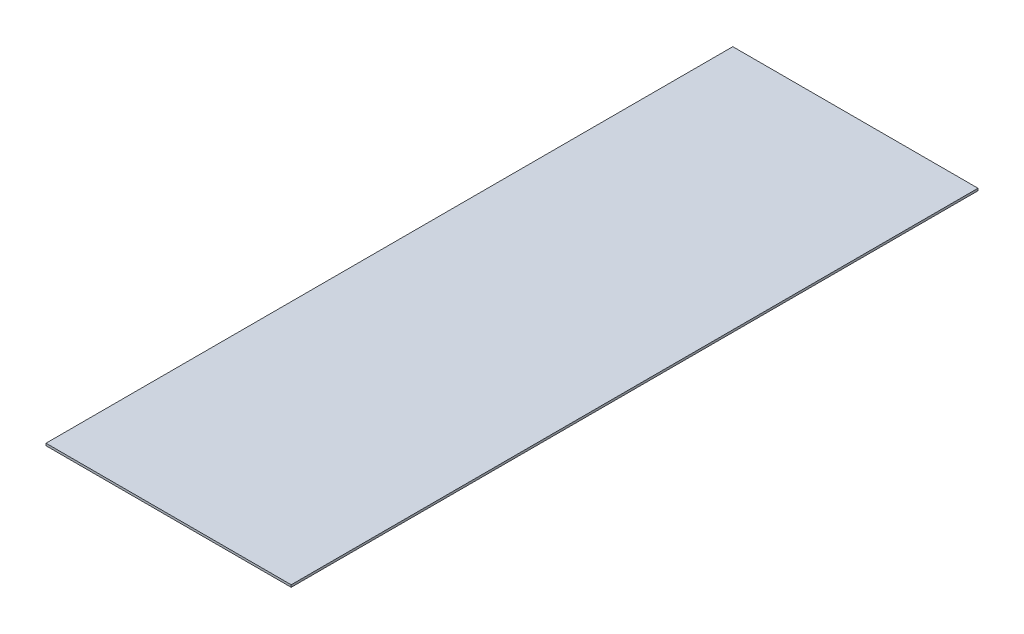
ISO-10303-21;
HEADER;
FILE_DESCRIPTION(('STEP AP214'),'2;1');
FILE_NAME('part.step','',(''),(''),'','','');
FILE_SCHEMA(('AUTOMOTIVE_DESIGN { 1 0 10303 214 1 1 1 1 }'));
ENDSEC;
DATA;
#1=APPLICATION_CONTEXT('core data for automotive mechanical design processes');
#2=APPLICATION_PROTOCOL_DEFINITION('international standard','automotive_design',2000,#1);
#3=PRODUCT_CONTEXT('',#1,'mechanical');
#4=PRODUCT('Part','Part','',(#3));
#5=PRODUCT_RELATED_PRODUCT_CATEGORY('part','',(#4));
#6=PRODUCT_DEFINITION_FORMATION('','',#4);
#7=PRODUCT_DEFINITION_CONTEXT('part definition',#1,'design');
#8=PRODUCT_DEFINITION('design','',#6,#7);
#9=PRODUCT_DEFINITION_SHAPE('','',#8);
#10=(LENGTH_UNIT() NAMED_UNIT(*) SI_UNIT(.MILLI.,.METRE.));
#11=(NAMED_UNIT(*) PLANE_ANGLE_UNIT() SI_UNIT($,.RADIAN.));
#12=(NAMED_UNIT(*) SI_UNIT($,.STERADIAN.) SOLID_ANGLE_UNIT());
#13=UNCERTAINTY_MEASURE_WITH_UNIT(LENGTH_MEASURE(1.E-05),#10,'distance_accuracy_value','');
#14=(GEOMETRIC_REPRESENTATION_CONTEXT(3) GLOBAL_UNCERTAINTY_ASSIGNED_CONTEXT((#13)) GLOBAL_UNIT_ASSIGNED_CONTEXT((#10,
#11,#12)) REPRESENTATION_CONTEXT('',''));
#15=CARTESIAN_POINT('',(0.,0.,0.));
#16=DIRECTION('',(0.,0.,1.));
#17=DIRECTION('',(1.,0.,0.));
#18=AXIS2_PLACEMENT_3D('',#15,#16,#17);
#19=CARTESIAN_POINT('',(220.,2.,616.25));
#20=DIRECTION('',(-1.,0.,0.));
#21=DIRECTION('',(0.,0.,1.));
#22=AXIS2_PLACEMENT_3D('',#19,#20,#21);
#23=PLANE('',#22);
#24=DIRECTION('',(0.,0.,-1.));
#25=VECTOR('',#24,1.);
#26=CARTESIAN_POINT('',(220.,-2.,616.25));
#27=LINE('',#26,#25);
#28=CARTESIAN_POINT('',(220.,-2.,616.25));
#29=VERTEX_POINT('',#28);
#30=CARTESIAN_POINT('',(220.,-2.,-616.25));
#31=VERTEX_POINT('',#30);
#32=EDGE_CURVE('E98',#29,#31,#27,.T.);
#33=ORIENTED_EDGE('',*,*,#32,.T.);
#34=DIRECTION('',(0.,-1.,0.));
#35=VECTOR('',#34,1.);
#36=CARTESIAN_POINT('',(220.,2.,-616.25));
#37=LINE('',#36,#35);
#38=CARTESIAN_POINT('',(220.,2.,-616.25));
#39=VERTEX_POINT('',#38);
#40=EDGE_CURVE('E11',#39,#31,#37,.T.);
#41=ORIENTED_EDGE('',*,*,#40,.F.);
#42=DIRECTION('',(0.,0.,-1.));
#43=VECTOR('',#42,1.);
#44=CARTESIAN_POINT('',(220.,2.,616.25));
#45=LINE('',#44,#43);
#46=CARTESIAN_POINT('',(220.,2.,616.25));
#47=VERTEX_POINT('',#46);
#48=EDGE_CURVE('E86',#47,#39,#45,.T.);
#49=ORIENTED_EDGE('',*,*,#48,.F.);
#50=DIRECTION('',(0.,-1.,0.));
#51=VECTOR('',#50,1.);
#52=CARTESIAN_POINT('',(220.,2.,616.25));
#53=LINE('',#52,#51);
#54=EDGE_CURVE('E94',#47,#29,#53,.T.);
#55=ORIENTED_EDGE('',*,*,#54,.T.);
#56=EDGE_LOOP('',(#33,#41,#49,#55));
#57=FACE_BOUND('',#56,.T.);
#58=ADVANCED_FACE('F35',(#57),#23,.F.);
#59=CARTESIAN_POINT('',(-220.,2.,-616.25));
#60=DIRECTION('',(0.,0.,1.));
#61=DIRECTION('',(1.,0.,0.));
#62=AXIS2_PLACEMENT_3D('',#59,#60,#61);
#63=PLANE('',#62);
#64=DIRECTION('',(-1.,0.,0.));
#65=VECTOR('',#64,1.);
#66=CARTESIAN_POINT('',(-220.,-2.,-616.25));
#67=LINE('',#66,#65);
#68=CARTESIAN_POINT('',(-220.,-2.,-616.25));
#69=VERTEX_POINT('',#68);
#70=EDGE_CURVE('E90',#31,#69,#67,.T.);
#71=ORIENTED_EDGE('',*,*,#70,.T.);
#72=DIRECTION('',(0.,-1.,0.));
#73=VECTOR('',#72,1.);
#74=CARTESIAN_POINT('',(-220.,2.,-616.25));
#75=LINE('',#74,#73);
#76=CARTESIAN_POINT('',(-220.,2.,-616.25));
#77=VERTEX_POINT('',#76);
#78=EDGE_CURVE('E43',#77,#69,#75,.T.);
#79=ORIENTED_EDGE('',*,*,#78,.F.);
#80=DIRECTION('',(-1.,0.,0.));
#81=VECTOR('',#80,1.);
#82=CARTESIAN_POINT('',(-220.,2.,-616.25));
#83=LINE('',#82,#81);
#84=EDGE_CURVE('E81',#39,#77,#83,.T.);
#85=ORIENTED_EDGE('',*,*,#84,.F.);
#86=ORIENTED_EDGE('',*,*,#40,.T.);
#87=EDGE_LOOP('',(#71,#79,#85,#86));
#88=FACE_BOUND('',#87,.T.);
#89=ADVANCED_FACE('F89',(#88),#63,.F.);
#90=CARTESIAN_POINT('',(-220.,2.,616.25));
#91=DIRECTION('',(1.,0.,0.));
#92=DIRECTION('',(0.,0.,-1.));
#93=AXIS2_PLACEMENT_3D('',#90,#91,#92);
#94=PLANE('',#93);
#95=DIRECTION('',(0.,0.,1.));
#96=VECTOR('',#95,1.);
#97=CARTESIAN_POINT('',(-220.,-2.,616.25));
#98=LINE('',#97,#96);
#99=CARTESIAN_POINT('',(-220.,-2.,616.25));
#100=VERTEX_POINT('',#99);
#101=EDGE_CURVE('E68',#69,#100,#98,.T.);
#102=ORIENTED_EDGE('',*,*,#101,.T.);
#103=DIRECTION('',(0.,-1.,0.));
#104=VECTOR('',#103,1.);
#105=CARTESIAN_POINT('',(-220.,2.,616.25));
#106=LINE('',#105,#104);
#107=CARTESIAN_POINT('',(-220.,2.,616.25));
#108=VERTEX_POINT('',#107);
#109=EDGE_CURVE('E91',#108,#100,#106,.T.);
#110=ORIENTED_EDGE('',*,*,#109,.F.);
#111=DIRECTION('',(0.,0.,1.));
#112=VECTOR('',#111,1.);
#113=CARTESIAN_POINT('',(-220.,2.,616.25));
#114=LINE('',#113,#112);
#115=EDGE_CURVE('E84',#77,#108,#114,.T.);
#116=ORIENTED_EDGE('',*,*,#115,.F.);
#117=ORIENTED_EDGE('',*,*,#78,.T.);
#118=EDGE_LOOP('',(#102,#110,#116,#117));
#119=FACE_BOUND('',#118,.T.);
#120=ADVANCED_FACE('F92',(#119),#94,.F.);
#121=CARTESIAN_POINT('',(-220.,2.,616.25));
#122=DIRECTION('',(0.,0.,-1.));
#123=DIRECTION('',(-1.,0.,0.));
#124=AXIS2_PLACEMENT_3D('',#121,#122,#123);
#125=PLANE('',#124);
#126=DIRECTION('',(1.,0.,0.));
#127=VECTOR('',#126,1.);
#128=CARTESIAN_POINT('',(-220.,-2.,616.25));
#129=LINE('',#128,#127);
#130=EDGE_CURVE('E74',#100,#29,#129,.T.);
#131=ORIENTED_EDGE('',*,*,#130,.T.);
#132=ORIENTED_EDGE('',*,*,#54,.F.);
#133=DIRECTION('',(1.,0.,0.));
#134=VECTOR('',#133,1.);
#135=CARTESIAN_POINT('',(-220.,2.,616.25));
#136=LINE('',#135,#134);
#137=EDGE_CURVE('E51',#108,#47,#136,.T.);
#138=ORIENTED_EDGE('',*,*,#137,.F.);
#139=ORIENTED_EDGE('',*,*,#109,.T.);
#140=EDGE_LOOP('',(#131,#132,#138,#139));
#141=FACE_BOUND('',#140,.T.);
#142=ADVANCED_FACE('F105',(#141),#125,.F.);
#143=CARTESIAN_POINT('',(0.,2.,0.));
#144=DIRECTION('',(0.,-1.,0.));
#145=DIRECTION('',(0.,0.,-1.));
#146=AXIS2_PLACEMENT_3D('',#143,#144,#145);
#147=PLANE('',#146);
#148=ORIENTED_EDGE('',*,*,#48,.T.);
#149=ORIENTED_EDGE('',*,*,#84,.T.);
#150=ORIENTED_EDGE('',*,*,#115,.T.);
#151=ORIENTED_EDGE('',*,*,#137,.T.);
#152=EDGE_LOOP('',(#148,#149,#150,#151));
#153=FACE_BOUND('',#152,.T.);
#154=ADVANCED_FACE('F82',(#153),#147,.F.);
#155=CARTESIAN_POINT('',(0.,-2.,0.));
#156=DIRECTION('',(0.,-1.,0.));
#157=DIRECTION('',(0.,0.,-1.));
#158=AXIS2_PLACEMENT_3D('',#155,#156,#157);
#159=PLANE('',#158);
#160=ORIENTED_EDGE('',*,*,#32,.F.);
#161=ORIENTED_EDGE('',*,*,#130,.F.);
#162=ORIENTED_EDGE('',*,*,#101,.F.);
#163=ORIENTED_EDGE('',*,*,#70,.F.);
#164=EDGE_LOOP('',(#160,#161,#162,#163));
#165=FACE_BOUND('',#164,.T.);
#166=ADVANCED_FACE('F108',(#165),#159,.T.);
#167=CLOSED_SHELL('',(#58,#89,#120,#142,#154,#166));
#168=MANIFOLD_SOLID_BREP('B2',#167);
#169=ADVANCED_BREP_SHAPE_REPRESENTATION('',(#18,#168),#14);
#170=SHAPE_DEFINITION_REPRESENTATION(#9,#169);
ENDSEC;
END-ISO-10303-21;
